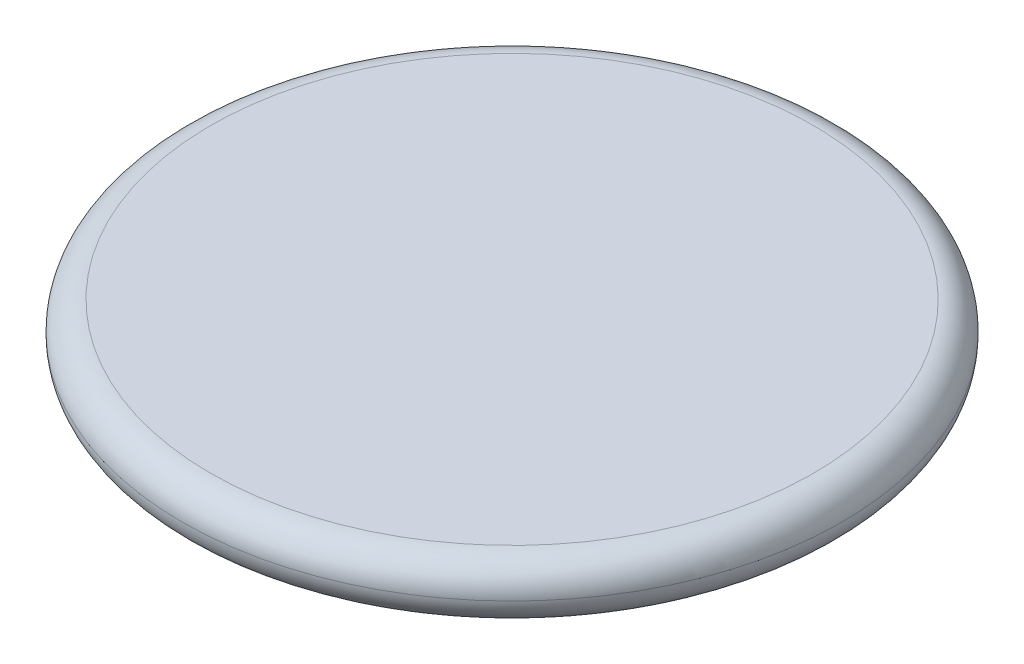
ISO-10303-21;
HEADER;
FILE_DESCRIPTION(('STEP AP214'),'2;1');
FILE_NAME('part.step','',(''),(''),'','','');
FILE_SCHEMA(('AUTOMOTIVE_DESIGN { 1 0 10303 214 1 1 1 1 }'));
ENDSEC;
DATA;
#1=APPLICATION_CONTEXT('core data for automotive mechanical design processes');
#2=APPLICATION_PROTOCOL_DEFINITION('international standard','automotive_design',2000,#1);
#3=PRODUCT_CONTEXT('',#1,'mechanical');
#4=PRODUCT('Part','Part','',(#3));
#5=PRODUCT_RELATED_PRODUCT_CATEGORY('part','',(#4));
#6=PRODUCT_DEFINITION_FORMATION('','',#4);
#7=PRODUCT_DEFINITION_CONTEXT('part definition',#1,'design');
#8=PRODUCT_DEFINITION('design','',#6,#7);
#9=PRODUCT_DEFINITION_SHAPE('','',#8);
#10=(LENGTH_UNIT() NAMED_UNIT(*) SI_UNIT(.MILLI.,.METRE.));
#11=(NAMED_UNIT(*) PLANE_ANGLE_UNIT() SI_UNIT($,.RADIAN.));
#12=(NAMED_UNIT(*) SI_UNIT($,.STERADIAN.) SOLID_ANGLE_UNIT());
#13=UNCERTAINTY_MEASURE_WITH_UNIT(LENGTH_MEASURE(1.E-05),#10,'distance_accuracy_value','');
#14=(GEOMETRIC_REPRESENTATION_CONTEXT(3) GLOBAL_UNCERTAINTY_ASSIGNED_CONTEXT((#13)) GLOBAL_UNIT_ASSIGNED_CONTEXT((#10,
#11,#12)) REPRESENTATION_CONTEXT('',''));
#15=CARTESIAN_POINT('',(0.,0.,0.));
#16=DIRECTION('',(0.,0.,1.));
#17=DIRECTION('',(1.,0.,0.));
#18=AXIS2_PLACEMENT_3D('',#15,#16,#17);
#19=CARTESIAN_POINT('',(0.,10.,0.));
#20=DIRECTION('',(0.,-1.,0.));
#21=DIRECTION('',(0.,0.,-1.));
#22=AXIS2_PLACEMENT_3D('',#19,#20,#21);
#23=CYLINDRICAL_SURFACE('',#22,2.);
#24=CARTESIAN_POINT('',(0.,10.,0.));
#25=DIRECTION('',(0.,1.,0.));
#26=DIRECTION('',(0.,0.,1.));
#27=AXIS2_PLACEMENT_3D('',#24,#25,#26);
#28=CIRCLE('',#27,2.);
#29=CARTESIAN_POINT('',(0.,10.,2.));
#30=VERTEX_POINT('',#29);
#31=EDGE_CURVE('E52',#30,#30,#28,.T.);
#32=ORIENTED_EDGE('',*,*,#31,.F.);
#33=EDGE_LOOP('',(#32));
#34=FACE_BOUND('',#33,.T.);
#35=CARTESIAN_POINT('',(0.,0.,0.));
#36=DIRECTION('',(0.,1.,0.));
#37=DIRECTION('',(0.,0.,1.));
#38=AXIS2_PLACEMENT_3D('',#35,#36,#37);
#39=CIRCLE('',#38,2.);
#40=CARTESIAN_POINT('',(0.,0.,2.));
#41=VERTEX_POINT('',#40);
#42=EDGE_CURVE('E55',#41,#41,#39,.T.);
#43=ORIENTED_EDGE('',*,*,#42,.T.);
#44=EDGE_LOOP('',(#43));
#45=FACE_BOUND('',#44,.T.);
#46=ADVANCED_FACE('F38',(#34,#45),#23,.T.);
#47=CARTESIAN_POINT('',(0.,0.,0.));
#48=DIRECTION('',(0.,1.,0.));
#49=DIRECTION('',(0.,0.,1.));
#50=AXIS2_PLACEMENT_3D('',#47,#48,#49);
#51=PLANE('',#50);
#52=ORIENTED_EDGE('',*,*,#42,.F.);
#53=EDGE_LOOP('',(#52));
#54=FACE_BOUND('',#53,.T.);
#55=ADVANCED_FACE('F67',(#54),#51,.F.);
#56=CARTESIAN_POINT('',(0.,13.,0.));
#57=DIRECTION('',(0.,1.,0.));
#58=DIRECTION('',(0.,0.,1.));
#59=AXIS2_PLACEMENT_3D('',#56,#57,#58);
#60=PLANE('',#59);
#61=CARTESIAN_POINT('',(0.,13.,0.));
#62=DIRECTION('',(0.,1.,0.));
#63=DIRECTION('',(0.,0.,1.));
#64=AXIS2_PLACEMENT_3D('',#61,#62,#63);
#65=CIRCLE('',#64,16.);
#66=CARTESIAN_POINT('',(0.,13.,16.));
#67=VERTEX_POINT('',#66);
#68=EDGE_CURVE('E47',#67,#67,#65,.T.);
#69=ORIENTED_EDGE('',*,*,#68,.T.);
#70=EDGE_LOOP('',(#69));
#71=FACE_BOUND('',#70,.T.);
#72=ADVANCED_FACE('F72',(#71),#60,.T.);
#73=CARTESIAN_POINT('',(0.,10.,0.));
#74=DIRECTION('',(0.,1.,0.));
#75=DIRECTION('',(0.,0.,1.));
#76=AXIS2_PLACEMENT_3D('',#73,#74,#75);
#77=PLANE('',#76);
#78=CARTESIAN_POINT('',(0.,10.,0.));
#79=DIRECTION('',(0.,1.,0.));
#80=DIRECTION('',(0.,0.,1.));
#81=AXIS2_PLACEMENT_3D('',#78,#79,#80);
#82=CIRCLE('',#81,16.);
#83=CARTESIAN_POINT('',(0.,10.,16.));
#84=VERTEX_POINT('',#83);
#85=EDGE_CURVE('E10',#84,#84,#82,.F.);
#86=ORIENTED_EDGE('',*,*,#85,.T.);
#87=EDGE_LOOP('',(#86));
#88=FACE_BOUND('',#87,.T.);
#89=ORIENTED_EDGE('',*,*,#31,.T.);
#90=EDGE_LOOP('',(#89));
#91=FACE_BOUND('',#90,.T.);
#92=ADVANCED_FACE('F63',(#88,#91),#77,.F.);
#93=CARTESIAN_POINT('',(0.,11.5,0.));
#94=DIRECTION('',(0.,1.,0.));
#95=DIRECTION('',(0.,0.,1.));
#96=AXIS2_PLACEMENT_3D('',#93,#94,#95);
#97=TOROIDAL_SURFACE('',#96,16.,1.5);
#98=ORIENTED_EDGE('',*,*,#85,.F.);
#99=EDGE_LOOP('',(#98));
#100=FACE_BOUND('',#99,.T.);
#101=CARTESIAN_POINT('',(0.,11.5,0.));
#102=DIRECTION('',(0.,1.,0.));
#103=DIRECTION('',(0.,0.,1.));
#104=AXIS2_PLACEMENT_3D('',#101,#102,#103);
#105=CIRCLE('',#104,17.5);
#106=CARTESIAN_POINT('',(0.,11.5,17.5));
#107=VERTEX_POINT('',#106);
#108=EDGE_CURVE('E42',#107,#107,#105,.T.);
#109=ORIENTED_EDGE('',*,*,#108,.F.);
#110=EDGE_LOOP('',(#109));
#111=FACE_BOUND('',#110,.T.);
#112=ADVANCED_FACE('F40',(#100,#111),#97,.T.);
#113=CARTESIAN_POINT('',(0.,11.5,0.));
#114=DIRECTION('',(0.,1.,0.));
#115=DIRECTION('',(0.,0.,1.));
#116=AXIS2_PLACEMENT_3D('',#113,#114,#115);
#117=TOROIDAL_SURFACE('',#116,16.,1.5);
#118=ORIENTED_EDGE('',*,*,#108,.T.);
#119=EDGE_LOOP('',(#118));
#120=FACE_BOUND('',#119,.T.);
#121=ORIENTED_EDGE('',*,*,#68,.F.);
#122=EDGE_LOOP('',(#121));
#123=FACE_BOUND('',#122,.T.);
#124=ADVANCED_FACE('F81',(#120,#123),#117,.T.);
#125=CLOSED_SHELL('',(#46,#55,#72,#92,#112,#124));
#126=MANIFOLD_SOLID_BREP('B2',#125);
#127=ADVANCED_BREP_SHAPE_REPRESENTATION('',(#18,#126),#14);
#128=SHAPE_DEFINITION_REPRESENTATION(#9,#127);
ENDSEC;
END-ISO-10303-21;
